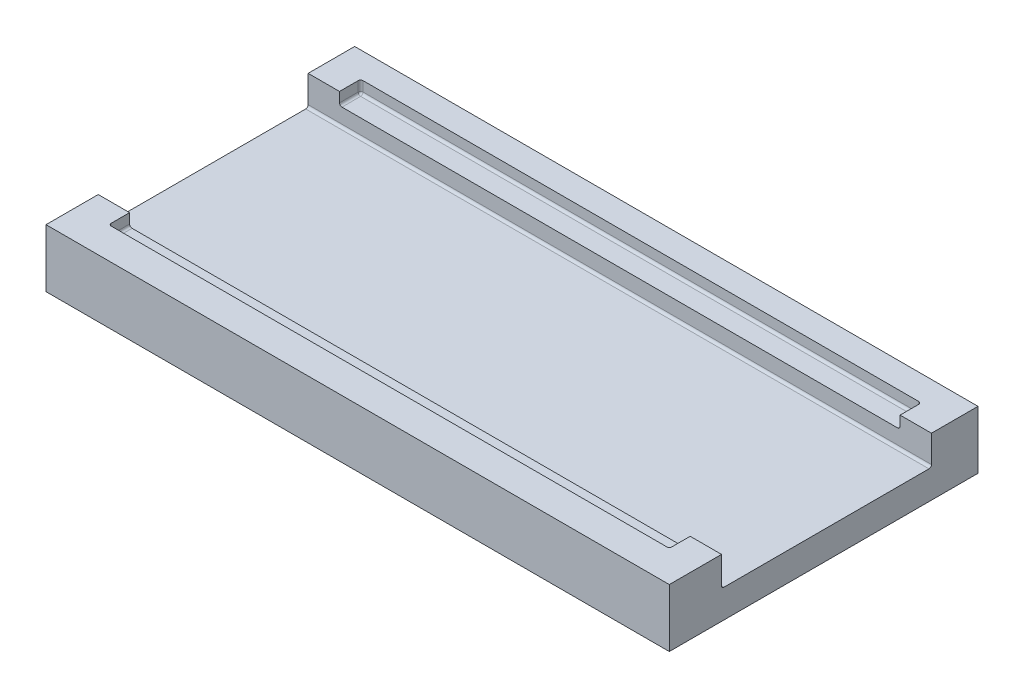
ISO-10303-21;
HEADER;
FILE_DESCRIPTION(('STEP AP214'),'2;1');
FILE_NAME('part.step','',(''),(''),'','','');
FILE_SCHEMA(('AUTOMOTIVE_DESIGN { 1 0 10303 214 1 1 1 1 }'));
ENDSEC;
DATA;
#1=APPLICATION_CONTEXT('core data for automotive mechanical design processes');
#2=APPLICATION_PROTOCOL_DEFINITION('international standard','automotive_design',2000,#1);
#3=PRODUCT_CONTEXT('',#1,'mechanical');
#4=PRODUCT('Part','Part','',(#3));
#5=PRODUCT_RELATED_PRODUCT_CATEGORY('part','',(#4));
#6=PRODUCT_DEFINITION_FORMATION('','',#4);
#7=PRODUCT_DEFINITION_CONTEXT('part definition',#1,'design');
#8=PRODUCT_DEFINITION('design','',#6,#7);
#9=PRODUCT_DEFINITION_SHAPE('','',#8);
#10=(LENGTH_UNIT() NAMED_UNIT(*) SI_UNIT(.MILLI.,.METRE.));
#11=(NAMED_UNIT(*) PLANE_ANGLE_UNIT() SI_UNIT($,.RADIAN.));
#12=(NAMED_UNIT(*) SI_UNIT($,.STERADIAN.) SOLID_ANGLE_UNIT());
#13=UNCERTAINTY_MEASURE_WITH_UNIT(LENGTH_MEASURE(1.E-05),#10,'distance_accuracy_value','');
#14=(GEOMETRIC_REPRESENTATION_CONTEXT(3) GLOBAL_UNCERTAINTY_ASSIGNED_CONTEXT((#13)) GLOBAL_UNIT_ASSIGNED_CONTEXT((#10,
#11,#12)) REPRESENTATION_CONTEXT('',''));
#15=CARTESIAN_POINT('',(0.,0.,0.));
#16=DIRECTION('',(0.,0.,1.));
#17=DIRECTION('',(1.,0.,0.));
#18=AXIS2_PLACEMENT_3D('',#15,#16,#17);
#19=CARTESIAN_POINT('',(0.,23.5,0.));
#20=DIRECTION('',(0.,-1.,0.));
#21=DIRECTION('',(0.,0.,-1.));
#22=AXIS2_PLACEMENT_3D('',#19,#20,#21);
#23=PLANE('',#22);
#24=DIRECTION('',(0.,0.,-1.));
#25=VECTOR('',#24,1.);
#26=CARTESIAN_POINT('',(252.4,23.5,0.));
#27=LINE('',#26,#25);
#28=CARTESIAN_POINT('',(252.4,23.5,0.));
#29=VERTEX_POINT('',#28);
#30=CARTESIAN_POINT('',(252.4,23.5,-21.15));
#31=VERTEX_POINT('',#30);
#32=EDGE_CURVE('E250',#29,#31,#27,.T.);
#33=ORIENTED_EDGE('',*,*,#32,.T.);
#34=DIRECTION('',(1.,0.,0.));
#35=VECTOR('',#34,1.);
#36=CARTESIAN_POINT('',(239.7,23.5,-21.15));
#37=LINE('',#36,#35);
#38=CARTESIAN_POINT('',(239.7,23.5,-21.15));
#39=VERTEX_POINT('',#38);
#40=EDGE_CURVE('E224',#39,#31,#37,.T.);
#41=ORIENTED_EDGE('',*,*,#40,.F.);
#42=DIRECTION('',(0.,0.,-1.));
#43=VECTOR('',#42,1.);
#44=CARTESIAN_POINT('',(239.7,23.5,-114.7));
#45=LINE('',#44,#43);
#46=CARTESIAN_POINT('',(239.7,23.5,-13.7));
#47=VERTEX_POINT('',#46);
#48=EDGE_CURVE('E230',#47,#39,#45,.T.);
#49=ORIENTED_EDGE('',*,*,#48,.F.);
#50=CARTESIAN_POINT('',(238.7,23.5,-13.7));
#51=DIRECTION('',(0.,-1.,0.));
#52=DIRECTION('',(0.,0.,-1.));
#53=AXIS2_PLACEMENT_3D('',#50,#51,#52);
#54=CIRCLE('',#53,1.);
#55=CARTESIAN_POINT('',(238.7,23.5,-12.7));
#56=VERTEX_POINT('',#55);
#57=EDGE_CURVE('E325',#47,#56,#54,.T.);
#58=ORIENTED_EDGE('',*,*,#57,.T.);
#59=DIRECTION('',(1.,0.,0.));
#60=VECTOR('',#59,1.);
#61=CARTESIAN_POINT('',(12.7000000000002,23.5,-12.7));
#62=LINE('',#61,#60);
#63=CARTESIAN_POINT('',(13.7000000000002,23.5,-12.7));
#64=VERTEX_POINT('',#63);
#65=EDGE_CURVE('E231',#64,#56,#62,.T.);
#66=ORIENTED_EDGE('',*,*,#65,.F.);
#67=CARTESIAN_POINT('',(13.7000000000002,23.5,-13.7));
#68=DIRECTION('',(0.,-1.,0.));
#69=DIRECTION('',(0.,0.,-1.));
#70=AXIS2_PLACEMENT_3D('',#67,#68,#69);
#71=CIRCLE('',#70,1.);
#72=CARTESIAN_POINT('',(12.7000000000002,23.5,-13.7));
#73=VERTEX_POINT('',#72);
#74=EDGE_CURVE('E331',#64,#73,#71,.T.);
#75=ORIENTED_EDGE('',*,*,#74,.T.);
#76=DIRECTION('',(0.,0.,1.));
#77=VECTOR('',#76,1.);
#78=CARTESIAN_POINT('',(12.7000000000001,23.5,-114.7));
#79=LINE('',#78,#77);
#80=CARTESIAN_POINT('',(12.7000000000001,23.5,-21.15));
#81=VERTEX_POINT('',#80);
#82=EDGE_CURVE('E423',#81,#73,#79,.T.);
#83=ORIENTED_EDGE('',*,*,#82,.F.);
#84=DIRECTION('',(1.,0.,0.));
#85=VECTOR('',#84,1.);
#86=CARTESIAN_POINT('',(1.38777878078145E-13,23.5,-21.15));
#87=LINE('',#86,#85);
#88=CARTESIAN_POINT('',(1.38777878078145E-13,23.5,-21.15));
#89=VERTEX_POINT('',#88);
#90=EDGE_CURVE('E452',#89,#81,#87,.T.);
#91=ORIENTED_EDGE('',*,*,#90,.F.);
#92=DIRECTION('',(0.,0.,1.));
#93=VECTOR('',#92,1.);
#94=CARTESIAN_POINT('',(0.,23.5,0.));
#95=LINE('',#94,#93);
#96=CARTESIAN_POINT('',(0.,23.5,0.));
#97=VERTEX_POINT('',#96);
#98=EDGE_CURVE('E247',#89,#97,#95,.T.);
#99=ORIENTED_EDGE('',*,*,#98,.T.);
#100=DIRECTION('',(1.,0.,0.));
#101=VECTOR('',#100,1.);
#102=CARTESIAN_POINT('',(0.,23.5,0.));
#103=LINE('',#102,#101);
#104=EDGE_CURVE('E246',#97,#29,#103,.T.);
#105=ORIENTED_EDGE('',*,*,#104,.T.);
#106=EDGE_LOOP('',(#33,#41,#49,#58,#66,#75,#83,#91,#99,#105));
#107=FACE_BOUND('',#106,.T.);
#108=ADVANCED_FACE('F33',(#107),#23,.F.);
#109=CARTESIAN_POINT('',(239.7,18.5,-114.7));
#110=DIRECTION('',(1.,0.,0.));
#111=DIRECTION('',(0.,0.,-1.));
#112=AXIS2_PLACEMENT_3D('',#109,#110,#111);
#113=PLANE('',#112);
#114=DIRECTION('',(0.,0.,-1.));
#115=VECTOR('',#114,1.);
#116=CARTESIAN_POINT('',(239.7,19.5,-114.7));
#117=LINE('',#116,#115);
#118=CARTESIAN_POINT('',(239.7,19.5,-21.15));
#119=VERTEX_POINT('',#118);
#120=CARTESIAN_POINT('',(239.7,19.5,-13.7));
#121=VERTEX_POINT('',#120);
#122=EDGE_CURVE('E275',#119,#121,#117,.F.);
#123=ORIENTED_EDGE('',*,*,#122,.T.);
#124=DIRECTION('',(0.,1.,0.));
#125=VECTOR('',#124,1.);
#126=CARTESIAN_POINT('',(239.7,23.5,-13.7));
#127=LINE('',#126,#125);
#128=EDGE_CURVE('E277',#121,#47,#127,.T.);
#129=ORIENTED_EDGE('',*,*,#128,.T.);
#130=ORIENTED_EDGE('',*,*,#48,.T.);
#131=DIRECTION('',(0.,1.,0.));
#132=VECTOR('',#131,1.);
#133=CARTESIAN_POINT('',(239.7,-74.4435279704062,-21.15));
#134=LINE('',#133,#132);
#135=EDGE_CURVE('E215',#119,#39,#134,.T.);
#136=ORIENTED_EDGE('',*,*,#135,.F.);
#137=EDGE_LOOP('',(#123,#129,#130,#136));
#138=FACE_BOUND('',#137,.T.);
#139=ADVANCED_FACE('F510',(#138),#113,.F.);
#140=CARTESIAN_POINT('',(12.7000000000001,18.5,-114.7));
#141=DIRECTION('',(-1.,0.,0.));
#142=DIRECTION('',(0.,0.,1.));
#143=AXIS2_PLACEMENT_3D('',#140,#141,#142);
#144=PLANE('',#143);
#145=DIRECTION('',(0.,0.,1.));
#146=VECTOR('',#145,1.);
#147=CARTESIAN_POINT('',(12.7000000000001,19.5,-114.7));
#148=LINE('',#147,#146);
#149=CARTESIAN_POINT('',(12.7000000000001,19.5,-106.15));
#150=VERTEX_POINT('',#149);
#151=CARTESIAN_POINT('',(12.7000000000001,19.5,-113.7));
#152=VERTEX_POINT('',#151);
#153=EDGE_CURVE('E304',#150,#152,#148,.F.);
#154=ORIENTED_EDGE('',*,*,#153,.T.);
#155=DIRECTION('',(0.,1.,0.));
#156=VECTOR('',#155,1.);
#157=CARTESIAN_POINT('',(12.7000000000001,23.5,-113.7));
#158=LINE('',#157,#156);
#159=CARTESIAN_POINT('',(12.7000000000001,23.5,-113.7));
#160=VERTEX_POINT('',#159);
#161=EDGE_CURVE('E306',#152,#160,#158,.T.);
#162=ORIENTED_EDGE('',*,*,#161,.T.);
#163=CARTESIAN_POINT('',(12.7000000000001,23.5,-106.15));
#164=VERTEX_POINT('',#163);
#165=EDGE_CURVE('E236',#160,#164,#79,.T.);
#166=ORIENTED_EDGE('',*,*,#165,.T.);
#167=DIRECTION('',(0.,1.,0.));
#168=VECTOR('',#167,1.);
#169=CARTESIAN_POINT('',(12.7000000000001,11.5,-106.15));
#170=LINE('',#169,#168);
#171=EDGE_CURVE('E403',#150,#164,#170,.T.);
#172=ORIENTED_EDGE('',*,*,#171,.F.);
#173=EDGE_LOOP('',(#154,#162,#166,#172));
#174=FACE_BOUND('',#173,.T.);
#175=ADVANCED_FACE('F407',(#174),#144,.F.);
#176=CARTESIAN_POINT('',(0.,18.5,0.));
#177=DIRECTION('',(0.,1.,0.));
#178=DIRECTION('',(0.,0.,1.));
#179=AXIS2_PLACEMENT_3D('',#176,#177,#178);
#180=PLANE('',#179);
#181=DIRECTION('',(-1.,0.,0.));
#182=VECTOR('',#181,1.);
#183=CARTESIAN_POINT('',(239.7,18.5,-106.15));
#184=LINE('',#183,#182);
#185=CARTESIAN_POINT('',(238.7,18.5,-106.15));
#186=VERTEX_POINT('',#185);
#187=CARTESIAN_POINT('',(13.7000000000001,18.5,-106.15));
#188=VERTEX_POINT('',#187);
#189=EDGE_CURVE('E405',#186,#188,#184,.T.);
#190=ORIENTED_EDGE('',*,*,#189,.F.);
#191=DIRECTION('',(0.,0.,-1.));
#192=VECTOR('',#191,1.);
#193=CARTESIAN_POINT('',(238.7,18.5,0.));
#194=LINE('',#193,#192);
#195=CARTESIAN_POINT('',(238.7,18.5,-113.7));
#196=VERTEX_POINT('',#195);
#197=EDGE_CURVE('E322',#186,#196,#194,.T.);
#198=ORIENTED_EDGE('',*,*,#197,.T.);
#199=DIRECTION('',(-1.,0.,0.));
#200=VECTOR('',#199,1.);
#201=CARTESIAN_POINT('',(0.,18.5,-113.7));
#202=LINE('',#201,#200);
#203=CARTESIAN_POINT('',(13.7000000000001,18.5,-113.7));
#204=VERTEX_POINT('',#203);
#205=EDGE_CURVE('E318',#196,#204,#202,.T.);
#206=ORIENTED_EDGE('',*,*,#205,.T.);
#207=DIRECTION('',(0.,0.,1.));
#208=VECTOR('',#207,1.);
#209=CARTESIAN_POINT('',(13.7000000000002,18.5,0.));
#210=LINE('',#209,#208);
#211=EDGE_CURVE('E320',#204,#188,#210,.T.);
#212=ORIENTED_EDGE('',*,*,#211,.T.);
#213=EDGE_LOOP('',(#190,#198,#206,#212));
#214=FACE_BOUND('',#213,.T.);
#215=ADVANCED_FACE('F392',(#214),#180,.T.);
#216=CARTESIAN_POINT('',(0.,23.5,0.));
#217=DIRECTION('',(1.,0.,0.));
#218=DIRECTION('',(0.,0.,-1.));
#219=AXIS2_PLACEMENT_3D('',#216,#217,#218);
#220=PLANE('',#219);
#221=DIRECTION('',(0.,0.,1.));
#222=VECTOR('',#221,1.);
#223=CARTESIAN_POINT('',(1.38777878078145E-13,11.5,-21.15));
#224=LINE('',#223,#222);
#225=CARTESIAN_POINT('',(1.38777878078145E-13,11.5,-105.15));
#226=VERTEX_POINT('',#225);
#227=CARTESIAN_POINT('',(1.38777878078145E-13,11.5,-22.15));
#228=VERTEX_POINT('',#227);
#229=EDGE_CURVE('E419',#226,#228,#224,.T.);
#230=ORIENTED_EDGE('',*,*,#229,.F.);
#231=CARTESIAN_POINT('',(1.16739951039335E-13,12.5,-105.15));
#232=DIRECTION('',(1.,0.,0.));
#233=DIRECTION('',(0.,0.,-1.));
#234=AXIS2_PLACEMENT_3D('',#231,#232,#233);
#235=CIRCLE('',#234,1.);
#236=CARTESIAN_POINT('',(1.38777878078145E-13,12.5,-106.15));
#237=VERTEX_POINT('',#236);
#238=EDGE_CURVE('E42',#226,#237,#235,.T.);
#239=ORIENTED_EDGE('',*,*,#238,.T.);
#240=DIRECTION('',(0.,1.,0.));
#241=VECTOR('',#240,1.);
#242=CARTESIAN_POINT('',(1.38777878078145E-13,11.5,-106.15));
#243=LINE('',#242,#241);
#244=CARTESIAN_POINT('',(1.38777878078145E-13,23.5,-106.15));
#245=VERTEX_POINT('',#244);
#246=EDGE_CURVE('E410',#237,#245,#243,.T.);
#247=ORIENTED_EDGE('',*,*,#246,.T.);
#248=CARTESIAN_POINT('',(1.38777878078145E-13,23.5,-125.));
#249=VERTEX_POINT('',#248);
#250=EDGE_CURVE('E243',#249,#245,#95,.T.);
#251=ORIENTED_EDGE('',*,*,#250,.F.);
#252=DIRECTION('',(0.,-1.,0.));
#253=VECTOR('',#252,1.);
#254=CARTESIAN_POINT('',(1.38777878078145E-13,23.5,-125.));
#255=LINE('',#254,#253);
#256=CARTESIAN_POINT('',(1.38777878078145E-13,0.,-125.));
#257=VERTEX_POINT('',#256);
#258=EDGE_CURVE('E255',#249,#257,#255,.T.);
#259=ORIENTED_EDGE('',*,*,#258,.T.);
#260=DIRECTION('',(0.,0.,1.));
#261=VECTOR('',#260,1.);
#262=CARTESIAN_POINT('',(0.,0.,0.));
#263=LINE('',#262,#261);
#264=CARTESIAN_POINT('',(0.,0.,0.));
#265=VERTEX_POINT('',#264);
#266=EDGE_CURVE('E242',#257,#265,#263,.T.);
#267=ORIENTED_EDGE('',*,*,#266,.T.);
#268=DIRECTION('',(0.,-1.,0.));
#269=VECTOR('',#268,1.);
#270=CARTESIAN_POINT('',(0.,23.5,0.));
#271=LINE('',#270,#269);
#272=EDGE_CURVE('E272',#97,#265,#271,.T.);
#273=ORIENTED_EDGE('',*,*,#272,.F.);
#274=ORIENTED_EDGE('',*,*,#98,.F.);
#275=DIRECTION('',(0.,1.,0.));
#276=VECTOR('',#275,1.);
#277=CARTESIAN_POINT('',(1.38777878078145E-13,11.5,-21.15));
#278=LINE('',#277,#276);
#279=CARTESIAN_POINT('',(1.38777878078145E-13,12.5,-21.15));
#280=VERTEX_POINT('',#279);
#281=EDGE_CURVE('E414',#280,#89,#278,.T.);
#282=ORIENTED_EDGE('',*,*,#281,.F.);
#283=CARTESIAN_POINT('',(0.,12.5,-22.15));
#284=DIRECTION('',(1.,0.,0.));
#285=DIRECTION('',(0.,0.,-1.));
#286=AXIS2_PLACEMENT_3D('',#283,#284,#285);
#287=CIRCLE('',#286,1.);
#288=EDGE_CURVE('E335',#280,#228,#287,.T.);
#289=ORIENTED_EDGE('',*,*,#288,.T.);
#290=EDGE_LOOP('',(#230,#239,#247,#251,#259,#267,#273,#274,#282,#289));
#291=FACE_BOUND('',#290,.T.);
#292=ADVANCED_FACE('F485',(#291),#220,.F.);
#293=CARTESIAN_POINT('',(0.,23.5,0.));
#294=DIRECTION('',(0.,0.,-1.));
#295=DIRECTION('',(-1.,0.,0.));
#296=AXIS2_PLACEMENT_3D('',#293,#294,#295);
#297=PLANE('',#296);
#298=DIRECTION('',(1.,0.,0.));
#299=VECTOR('',#298,1.);
#300=CARTESIAN_POINT('',(0.,0.,0.));
#301=LINE('',#300,#299);
#302=CARTESIAN_POINT('',(252.4,0.,0.));
#303=VERTEX_POINT('',#302);
#304=EDGE_CURVE('E258',#265,#303,#301,.T.);
#305=ORIENTED_EDGE('',*,*,#304,.T.);
#306=DIRECTION('',(0.,-1.,0.));
#307=VECTOR('',#306,1.);
#308=CARTESIAN_POINT('',(252.4,23.5,0.));
#309=LINE('',#308,#307);
#310=EDGE_CURVE('E269',#29,#303,#309,.T.);
#311=ORIENTED_EDGE('',*,*,#310,.F.);
#312=ORIENTED_EDGE('',*,*,#104,.F.);
#313=ORIENTED_EDGE('',*,*,#272,.T.);
#314=EDGE_LOOP('',(#305,#311,#312,#313));
#315=FACE_BOUND('',#314,.T.);
#316=ADVANCED_FACE('F488',(#315),#297,.F.);
#317=CARTESIAN_POINT('',(252.4,23.5,0.));
#318=DIRECTION('',(-1.,0.,0.));
#319=DIRECTION('',(0.,0.,1.));
#320=AXIS2_PLACEMENT_3D('',#317,#318,#319);
#321=PLANE('',#320);
#322=DIRECTION('',(0.,0.,-1.));
#323=VECTOR('',#322,1.);
#324=CARTESIAN_POINT('',(252.4,11.5,-21.15));
#325=LINE('',#324,#323);
#326=CARTESIAN_POINT('',(252.4,11.5,-22.15));
#327=VERTEX_POINT('',#326);
#328=CARTESIAN_POINT('',(252.4,11.5,-105.15));
#329=VERTEX_POINT('',#328);
#330=EDGE_CURVE('E462',#327,#329,#325,.T.);
#331=ORIENTED_EDGE('',*,*,#330,.F.);
#332=CARTESIAN_POINT('',(252.4,12.5,-22.15));
#333=DIRECTION('',(-1.,0.,0.));
#334=DIRECTION('',(0.,0.,1.));
#335=AXIS2_PLACEMENT_3D('',#332,#333,#334);
#336=CIRCLE('',#335,1.);
#337=CARTESIAN_POINT('',(252.4,12.5,-21.15));
#338=VERTEX_POINT('',#337);
#339=EDGE_CURVE('E333',#327,#338,#336,.T.);
#340=ORIENTED_EDGE('',*,*,#339,.T.);
#341=DIRECTION('',(0.,1.,0.));
#342=VECTOR('',#341,1.);
#343=CARTESIAN_POINT('',(252.4,-74.4435279704062,-21.15));
#344=LINE('',#343,#342);
#345=EDGE_CURVE('E223',#338,#31,#344,.T.);
#346=ORIENTED_EDGE('',*,*,#345,.T.);
#347=ORIENTED_EDGE('',*,*,#32,.F.);
#348=ORIENTED_EDGE('',*,*,#310,.T.);
#349=DIRECTION('',(0.,0.,-1.));
#350=VECTOR('',#349,1.);
#351=CARTESIAN_POINT('',(252.4,0.,0.));
#352=LINE('',#351,#350);
#353=CARTESIAN_POINT('',(252.4,0.,-125.));
#354=VERTEX_POINT('',#353);
#355=EDGE_CURVE('E260',#303,#354,#352,.T.);
#356=ORIENTED_EDGE('',*,*,#355,.T.);
#357=DIRECTION('',(0.,-1.,0.));
#358=VECTOR('',#357,1.);
#359=CARTESIAN_POINT('',(252.4,23.5,-125.));
#360=LINE('',#359,#358);
#361=CARTESIAN_POINT('',(252.4,23.5,-125.));
#362=VERTEX_POINT('',#361);
#363=EDGE_CURVE('E266',#362,#354,#360,.T.);
#364=ORIENTED_EDGE('',*,*,#363,.F.);
#365=CARTESIAN_POINT('',(252.4,23.5,-106.15));
#366=VERTEX_POINT('',#365);
#367=EDGE_CURVE('E249',#366,#362,#27,.T.);
#368=ORIENTED_EDGE('',*,*,#367,.F.);
#369=DIRECTION('',(0.,1.,0.));
#370=VECTOR('',#369,1.);
#371=CARTESIAN_POINT('',(252.4,-74.4435279704062,-106.15));
#372=LINE('',#371,#370);
#373=CARTESIAN_POINT('',(252.4,12.5,-106.15));
#374=VERTEX_POINT('',#373);
#375=EDGE_CURVE('E216',#374,#366,#372,.T.);
#376=ORIENTED_EDGE('',*,*,#375,.F.);
#377=CARTESIAN_POINT('',(252.4,12.5,-105.15));
#378=DIRECTION('',(-1.,0.,0.));
#379=DIRECTION('',(0.,0.,1.));
#380=AXIS2_PLACEMENT_3D('',#377,#378,#379);
#381=CIRCLE('',#380,1.);
#382=EDGE_CURVE('E11',#374,#329,#381,.T.);
#383=ORIENTED_EDGE('',*,*,#382,.T.);
#384=EDGE_LOOP('',(#331,#340,#346,#347,#348,#356,#364,#368,#376,#383));
#385=FACE_BOUND('',#384,.T.);
#386=ADVANCED_FACE('F476',(#385),#321,.F.);
#387=CARTESIAN_POINT('',(1.38777878078145E-13,23.5,-125.));
#388=DIRECTION('',(0.,0.,1.));
#389=DIRECTION('',(1.,0.,0.));
#390=AXIS2_PLACEMENT_3D('',#387,#388,#389);
#391=PLANE('',#390);
#392=DIRECTION('',(-1.,0.,0.));
#393=VECTOR('',#392,1.);
#394=CARTESIAN_POINT('',(1.38777878078145E-13,0.,-125.));
#395=LINE('',#394,#393);
#396=EDGE_CURVE('E262',#354,#257,#395,.T.);
#397=ORIENTED_EDGE('',*,*,#396,.T.);
#398=ORIENTED_EDGE('',*,*,#258,.F.);
#399=DIRECTION('',(-1.,0.,0.));
#400=VECTOR('',#399,1.);
#401=CARTESIAN_POINT('',(1.38777878078145E-13,23.5,-125.));
#402=LINE('',#401,#400);
#403=EDGE_CURVE('E253',#362,#249,#402,.T.);
#404=ORIENTED_EDGE('',*,*,#403,.F.);
#405=ORIENTED_EDGE('',*,*,#363,.T.);
#406=EDGE_LOOP('',(#397,#398,#404,#405));
#407=FACE_BOUND('',#406,.T.);
#408=ADVANCED_FACE('F496',(#407),#391,.F.);
#409=CARTESIAN_POINT('',(239.7,23.5,-106.15));
#410=VERTEX_POINT('',#409);
#411=CARTESIAN_POINT('',(239.7,23.5,-113.7));
#412=VERTEX_POINT('',#411);
#413=EDGE_CURVE('E210',#410,#412,#45,.T.);
#414=ORIENTED_EDGE('',*,*,#413,.F.);
#415=DIRECTION('',(-1.,0.,0.));
#416=VECTOR('',#415,1.);
#417=CARTESIAN_POINT('',(239.7,23.5,-106.15));
#418=LINE('',#417,#416);
#419=EDGE_CURVE('E219',#366,#410,#418,.T.);
#420=ORIENTED_EDGE('',*,*,#419,.F.);
#421=ORIENTED_EDGE('',*,*,#367,.T.);
#422=ORIENTED_EDGE('',*,*,#403,.T.);
#423=ORIENTED_EDGE('',*,*,#250,.T.);
#424=DIRECTION('',(-1.,0.,0.));
#425=VECTOR('',#424,1.);
#426=CARTESIAN_POINT('',(1.38777878078145E-13,23.5,-106.15));
#427=LINE('',#426,#425);
#428=EDGE_CURVE('E455',#164,#245,#427,.T.);
#429=ORIENTED_EDGE('',*,*,#428,.F.);
#430=ORIENTED_EDGE('',*,*,#165,.F.);
#431=CARTESIAN_POINT('',(13.7000000000001,23.5,-113.7));
#432=DIRECTION('',(0.,-1.,0.));
#433=DIRECTION('',(0.,0.,-1.));
#434=AXIS2_PLACEMENT_3D('',#431,#432,#433);
#435=CIRCLE('',#434,1.);
#436=CARTESIAN_POINT('',(13.7000000000001,23.5,-114.7));
#437=VERTEX_POINT('',#436);
#438=EDGE_CURVE('E337',#160,#437,#435,.T.);
#439=ORIENTED_EDGE('',*,*,#438,.T.);
#440=DIRECTION('',(-1.,0.,0.));
#441=VECTOR('',#440,1.);
#442=CARTESIAN_POINT('',(12.7000000000001,23.5,-114.7));
#443=LINE('',#442,#441);
#444=CARTESIAN_POINT('',(238.7,23.5,-114.7));
#445=VERTEX_POINT('',#444);
#446=EDGE_CURVE('E234',#445,#437,#443,.T.);
#447=ORIENTED_EDGE('',*,*,#446,.F.);
#448=CARTESIAN_POINT('',(238.7,23.5,-113.7));
#449=DIRECTION('',(0.,-1.,0.));
#450=DIRECTION('',(0.,0.,-1.));
#451=AXIS2_PLACEMENT_3D('',#448,#449,#450);
#452=CIRCLE('',#451,1.);
#453=EDGE_CURVE('E229',#445,#412,#452,.T.);
#454=ORIENTED_EDGE('',*,*,#453,.T.);
#455=EDGE_LOOP('',(#414,#420,#421,#422,#423,#429,#430,#439,#447,#454));
#456=FACE_BOUND('',#455,.T.);
#457=ADVANCED_FACE('F226',(#456),#23,.F.);
#458=CARTESIAN_POINT('',(0.,0.,0.));
#459=DIRECTION('',(0.,-1.,0.));
#460=DIRECTION('',(0.,0.,-1.));
#461=AXIS2_PLACEMENT_3D('',#458,#459,#460);
#462=PLANE('',#461);
#463=ORIENTED_EDGE('',*,*,#266,.F.);
#464=ORIENTED_EDGE('',*,*,#396,.F.);
#465=ORIENTED_EDGE('',*,*,#355,.F.);
#466=ORIENTED_EDGE('',*,*,#304,.F.);
#467=EDGE_LOOP('',(#463,#464,#465,#466));
#468=FACE_BOUND('',#467,.T.);
#469=ADVANCED_FACE('F491',(#468),#462,.T.);
#470=DIRECTION('',(0.,1.,0.));
#471=VECTOR('',#470,1.);
#472=CARTESIAN_POINT('',(12.7000000000002,18.5,-13.7));
#473=LINE('',#472,#471);
#474=CARTESIAN_POINT('',(12.7000000000002,19.5,-13.7));
#475=VERTEX_POINT('',#474);
#476=EDGE_CURVE('E292',#73,#475,#473,.F.);
#477=ORIENTED_EDGE('',*,*,#476,.T.);
#478=DIRECTION('',(0.,0.,1.));
#479=VECTOR('',#478,1.);
#480=CARTESIAN_POINT('',(12.7000000000001,19.5,-114.7));
#481=LINE('',#480,#479);
#482=CARTESIAN_POINT('',(12.7000000000001,19.5,-21.15));
#483=VERTEX_POINT('',#482);
#484=EDGE_CURVE('E294',#475,#483,#481,.F.);
#485=ORIENTED_EDGE('',*,*,#484,.T.);
#486=DIRECTION('',(0.,1.,0.));
#487=VECTOR('',#486,1.);
#488=CARTESIAN_POINT('',(12.7000000000001,11.5,-21.15));
#489=LINE('',#488,#487);
#490=EDGE_CURVE('E411',#483,#81,#489,.T.);
#491=ORIENTED_EDGE('',*,*,#490,.T.);
#492=ORIENTED_EDGE('',*,*,#82,.T.);
#493=EDGE_LOOP('',(#477,#485,#491,#492));
#494=FACE_BOUND('',#493,.T.);
#495=ADVANCED_FACE('F428',(#494),#144,.F.);
#496=CARTESIAN_POINT('',(12.7000000000001,18.5,-114.7));
#497=DIRECTION('',(0.,0.,-1.));
#498=DIRECTION('',(-1.,0.,0.));
#499=AXIS2_PLACEMENT_3D('',#496,#497,#498);
#500=PLANE('',#499);
#501=ORIENTED_EDGE('',*,*,#446,.T.);
#502=DIRECTION('',(0.,1.,0.));
#503=VECTOR('',#502,1.);
#504=CARTESIAN_POINT('',(13.7000000000001,18.5,-114.7));
#505=LINE('',#504,#503);
#506=CARTESIAN_POINT('',(13.7000000000001,19.5,-114.7));
#507=VERTEX_POINT('',#506);
#508=EDGE_CURVE('E313',#437,#507,#505,.F.);
#509=ORIENTED_EDGE('',*,*,#508,.T.);
#510=DIRECTION('',(-1.,0.,0.));
#511=VECTOR('',#510,1.);
#512=CARTESIAN_POINT('',(12.7000000000001,19.5,-114.7));
#513=LINE('',#512,#511);
#514=CARTESIAN_POINT('',(238.7,19.5,-114.7));
#515=VERTEX_POINT('',#514);
#516=EDGE_CURVE('E309',#507,#515,#513,.F.);
#517=ORIENTED_EDGE('',*,*,#516,.T.);
#518=DIRECTION('',(0.,1.,0.));
#519=VECTOR('',#518,1.);
#520=CARTESIAN_POINT('',(238.7,23.5,-114.7));
#521=LINE('',#520,#519);
#522=EDGE_CURVE('E311',#515,#445,#521,.T.);
#523=ORIENTED_EDGE('',*,*,#522,.T.);
#524=EDGE_LOOP('',(#501,#509,#517,#523));
#525=FACE_BOUND('',#524,.T.);
#526=ADVANCED_FACE('F575',(#525),#500,.F.);
#527=ORIENTED_EDGE('',*,*,#413,.T.);
#528=DIRECTION('',(0.,1.,0.));
#529=VECTOR('',#528,1.);
#530=CARTESIAN_POINT('',(239.7,18.5,-113.7));
#531=LINE('',#530,#529);
#532=CARTESIAN_POINT('',(239.7,19.5,-113.7));
#533=VERTEX_POINT('',#532);
#534=EDGE_CURVE('E316',#412,#533,#531,.F.);
#535=ORIENTED_EDGE('',*,*,#534,.T.);
#536=DIRECTION('',(0.,0.,-1.));
#537=VECTOR('',#536,1.);
#538=CARTESIAN_POINT('',(239.7,19.5,-114.7));
#539=LINE('',#538,#537);
#540=CARTESIAN_POINT('',(239.7,19.5,-106.15));
#541=VERTEX_POINT('',#540);
#542=EDGE_CURVE('E213',#533,#541,#539,.F.);
#543=ORIENTED_EDGE('',*,*,#542,.T.);
#544=DIRECTION('',(0.,1.,0.));
#545=VECTOR('',#544,1.);
#546=CARTESIAN_POINT('',(239.7,-74.4435279704062,-106.15));
#547=LINE('',#546,#545);
#548=EDGE_CURVE('E206',#541,#410,#547,.T.);
#549=ORIENTED_EDGE('',*,*,#548,.T.);
#550=EDGE_LOOP('',(#527,#535,#543,#549));
#551=FACE_BOUND('',#550,.T.);
#552=ADVANCED_FACE('F208',(#551),#113,.F.);
#553=CARTESIAN_POINT('',(12.7000000000002,18.5,-12.7));
#554=DIRECTION('',(0.,0.,1.));
#555=DIRECTION('',(1.,0.,0.));
#556=AXIS2_PLACEMENT_3D('',#553,#554,#555);
#557=PLANE('',#556);
#558=ORIENTED_EDGE('',*,*,#65,.T.);
#559=DIRECTION('',(0.,1.,0.));
#560=VECTOR('',#559,1.);
#561=CARTESIAN_POINT('',(238.7,18.5,-12.7));
#562=LINE('',#561,#560);
#563=CARTESIAN_POINT('',(238.7,19.5,-12.7));
#564=VERTEX_POINT('',#563);
#565=EDGE_CURVE('E284',#56,#564,#562,.F.);
#566=ORIENTED_EDGE('',*,*,#565,.T.);
#567=DIRECTION('',(1.,0.,0.));
#568=VECTOR('',#567,1.);
#569=CARTESIAN_POINT('',(12.7000000000002,19.5,-12.7));
#570=LINE('',#569,#568);
#571=CARTESIAN_POINT('',(13.7000000000002,19.5,-12.7));
#572=VERTEX_POINT('',#571);
#573=EDGE_CURVE('E280',#564,#572,#570,.F.);
#574=ORIENTED_EDGE('',*,*,#573,.T.);
#575=DIRECTION('',(0.,1.,0.));
#576=VECTOR('',#575,1.);
#577=CARTESIAN_POINT('',(13.7000000000002,23.5,-12.7));
#578=LINE('',#577,#576);
#579=EDGE_CURVE('E282',#572,#64,#578,.T.);
#580=ORIENTED_EDGE('',*,*,#579,.T.);
#581=EDGE_LOOP('',(#558,#566,#574,#580));
#582=FACE_BOUND('',#581,.T.);
#583=ADVANCED_FACE('F584',(#582),#557,.F.);
#584=DIRECTION('',(1.,0.,0.));
#585=VECTOR('',#584,1.);
#586=CARTESIAN_POINT('',(0.,18.5,-13.7));
#587=LINE('',#586,#585);
#588=CARTESIAN_POINT('',(13.7000000000002,18.5,-13.7));
#589=VERTEX_POINT('',#588);
#590=CARTESIAN_POINT('',(238.7,18.5,-13.7));
#591=VERTEX_POINT('',#590);
#592=EDGE_CURVE('E286',#589,#591,#587,.T.);
#593=ORIENTED_EDGE('',*,*,#592,.T.);
#594=DIRECTION('',(0.,0.,-1.));
#595=VECTOR('',#594,1.);
#596=CARTESIAN_POINT('',(238.7,18.5,0.));
#597=LINE('',#596,#595);
#598=CARTESIAN_POINT('',(238.7,18.5,-21.15));
#599=VERTEX_POINT('',#598);
#600=EDGE_CURVE('E290',#591,#599,#597,.T.);
#601=ORIENTED_EDGE('',*,*,#600,.T.);
#602=DIRECTION('',(1.,0.,0.));
#603=VECTOR('',#602,1.);
#604=CARTESIAN_POINT('',(239.7,18.5,-21.15));
#605=LINE('',#604,#603);
#606=CARTESIAN_POINT('',(13.7000000000002,18.5,-21.15));
#607=VERTEX_POINT('',#606);
#608=EDGE_CURVE('E421',#607,#599,#605,.T.);
#609=ORIENTED_EDGE('',*,*,#608,.F.);
#610=DIRECTION('',(0.,0.,1.));
#611=VECTOR('',#610,1.);
#612=CARTESIAN_POINT('',(13.7000000000002,18.5,0.));
#613=LINE('',#612,#611);
#614=EDGE_CURVE('E288',#607,#589,#613,.T.);
#615=ORIENTED_EDGE('',*,*,#614,.T.);
#616=EDGE_LOOP('',(#593,#601,#609,#615));
#617=FACE_BOUND('',#616,.T.);
#618=ADVANCED_FACE('F586',(#617),#180,.T.);
#619=CARTESIAN_POINT('',(239.7,11.5,-21.15));
#620=DIRECTION('',(0.,0.,1.));
#621=DIRECTION('',(1.,0.,0.));
#622=AXIS2_PLACEMENT_3D('',#619,#620,#621);
#623=PLANE('',#622);
#624=ORIENTED_EDGE('',*,*,#345,.F.);
#625=DIRECTION('',(1.,0.,0.));
#626=VECTOR('',#625,1.);
#627=CARTESIAN_POINT('',(1.38777878078145E-13,12.5,-21.15));
#628=LINE('',#627,#626);
#629=EDGE_CURVE('E302',#338,#280,#628,.F.);
#630=ORIENTED_EDGE('',*,*,#629,.T.);
#631=ORIENTED_EDGE('',*,*,#281,.T.);
#632=ORIENTED_EDGE('',*,*,#90,.T.);
#633=ORIENTED_EDGE('',*,*,#490,.F.);
#634=CARTESIAN_POINT('',(13.7000000000002,19.5,-21.15));
#635=DIRECTION('',(0.,0.,1.));
#636=DIRECTION('',(1.,0.,0.));
#637=AXIS2_PLACEMENT_3D('',#634,#635,#636);
#638=CIRCLE('',#637,1.);
#639=EDGE_CURVE('E329',#483,#607,#638,.T.);
#640=ORIENTED_EDGE('',*,*,#639,.T.);
#641=ORIENTED_EDGE('',*,*,#608,.T.);
#642=CARTESIAN_POINT('',(238.7,19.5,-21.15));
#643=DIRECTION('',(0.,0.,1.));
#644=DIRECTION('',(1.,0.,0.));
#645=AXIS2_PLACEMENT_3D('',#642,#643,#644);
#646=CIRCLE('',#645,1.);
#647=EDGE_CURVE('E327',#599,#119,#646,.T.);
#648=ORIENTED_EDGE('',*,*,#647,.T.);
#649=ORIENTED_EDGE('',*,*,#135,.T.);
#650=ORIENTED_EDGE('',*,*,#40,.T.);
#651=EDGE_LOOP('',(#624,#630,#631,#632,#633,#640,#641,#648,#649,#650));
#652=FACE_BOUND('',#651,.T.);
#653=ADVANCED_FACE('F450',(#652),#623,.F.);
#654=CARTESIAN_POINT('',(239.7,11.5,-106.15));
#655=DIRECTION('',(0.,0.,-1.));
#656=DIRECTION('',(-1.,0.,0.));
#657=AXIS2_PLACEMENT_3D('',#654,#655,#656);
#658=PLANE('',#657);
#659=ORIENTED_EDGE('',*,*,#246,.F.);
#660=DIRECTION('',(-1.,0.,0.));
#661=VECTOR('',#660,1.);
#662=CARTESIAN_POINT('',(252.4,12.5,-106.15));
#663=LINE('',#662,#661);
#664=EDGE_CURVE('E50',#237,#374,#663,.F.);
#665=ORIENTED_EDGE('',*,*,#664,.T.);
#666=ORIENTED_EDGE('',*,*,#375,.T.);
#667=ORIENTED_EDGE('',*,*,#419,.T.);
#668=ORIENTED_EDGE('',*,*,#548,.F.);
#669=CARTESIAN_POINT('',(238.7,19.5,-106.15));
#670=DIRECTION('',(0.,0.,-1.));
#671=DIRECTION('',(-1.,0.,0.));
#672=AXIS2_PLACEMENT_3D('',#669,#670,#671);
#673=CIRCLE('',#672,1.);
#674=EDGE_CURVE('E340',#541,#186,#673,.T.);
#675=ORIENTED_EDGE('',*,*,#674,.T.);
#676=ORIENTED_EDGE('',*,*,#189,.T.);
#677=CARTESIAN_POINT('',(13.7000000000001,19.5,-106.15));
#678=DIRECTION('',(0.,0.,-1.));
#679=DIRECTION('',(-1.,0.,0.));
#680=AXIS2_PLACEMENT_3D('',#677,#678,#679);
#681=CIRCLE('',#680,1.);
#682=EDGE_CURVE('E342',#188,#150,#681,.T.);
#683=ORIENTED_EDGE('',*,*,#682,.T.);
#684=ORIENTED_EDGE('',*,*,#171,.T.);
#685=ORIENTED_EDGE('',*,*,#428,.T.);
#686=EDGE_LOOP('',(#659,#665,#666,#667,#668,#675,#676,#683,#684,#685));
#687=FACE_BOUND('',#686,.T.);
#688=ADVANCED_FACE('F220',(#687),#658,.F.);
#689=CARTESIAN_POINT('',(0.,11.5,0.));
#690=DIRECTION('',(0.,-1.,0.));
#691=DIRECTION('',(0.,0.,-1.));
#692=AXIS2_PLACEMENT_3D('',#689,#690,#691);
#693=PLANE('',#692);
#694=ORIENTED_EDGE('',*,*,#229,.T.);
#695=DIRECTION('',(1.,0.,0.));
#696=VECTOR('',#695,1.);
#697=CARTESIAN_POINT('',(252.4,11.5,-22.15));
#698=LINE('',#697,#696);
#699=EDGE_CURVE('E299',#228,#327,#698,.T.);
#700=ORIENTED_EDGE('',*,*,#699,.T.);
#701=ORIENTED_EDGE('',*,*,#330,.T.);
#702=DIRECTION('',(-1.,0.,0.));
#703=VECTOR('',#702,1.);
#704=CARTESIAN_POINT('',(1.38900149336363E-13,11.5,-105.15));
#705=LINE('',#704,#703);
#706=EDGE_CURVE('E296',#329,#226,#705,.T.);
#707=ORIENTED_EDGE('',*,*,#706,.T.);
#708=EDGE_LOOP('',(#694,#700,#701,#707));
#709=FACE_BOUND('',#708,.T.);
#710=ADVANCED_FACE('F483',(#709),#693,.F.);
#711=CARTESIAN_POINT('',(13.7000000000002,18.5,-13.7));
#712=DIRECTION('',(0.,-1.,0.));
#713=DIRECTION('',(0.,0.,-1.));
#714=AXIS2_PLACEMENT_3D('',#711,#712,#713);
#715=CYLINDRICAL_SURFACE('',#714,1.);
#716=ORIENTED_EDGE('',*,*,#74,.F.);
#717=ORIENTED_EDGE('',*,*,#579,.F.);
#718=CARTESIAN_POINT('',(13.7000000000002,19.5,-13.7));
#719=DIRECTION('',(0.,1.,0.));
#720=DIRECTION('',(0.,0.,1.));
#721=AXIS2_PLACEMENT_3D('',#718,#719,#720);
#722=CIRCLE('',#721,1.);
#723=EDGE_CURVE('E360',#475,#572,#722,.T.);
#724=ORIENTED_EDGE('',*,*,#723,.F.);
#725=ORIENTED_EDGE('',*,*,#476,.F.);
#726=EDGE_LOOP('',(#716,#717,#724,#725));
#727=FACE_BOUND('',#726,.T.);
#728=ADVANCED_FACE('F437',(#727),#715,.F.);
#729=CARTESIAN_POINT('',(13.7000000000002,19.5,0.));
#730=DIRECTION('',(0.,0.,1.));
#731=DIRECTION('',(1.,0.,0.));
#732=AXIS2_PLACEMENT_3D('',#729,#730,#731);
#733=CYLINDRICAL_SURFACE('',#732,1.);
#734=ORIENTED_EDGE('',*,*,#639,.F.);
#735=ORIENTED_EDGE('',*,*,#484,.F.);
#736=CARTESIAN_POINT('',(13.7000000000002,19.5,-13.7));
#737=DIRECTION('',(0.,0.,-1.));
#738=DIRECTION('',(-1.,0.,0.));
#739=AXIS2_PLACEMENT_3D('',#736,#737,#738);
#740=CIRCLE('',#739,1.);
#741=EDGE_CURVE('E357',#589,#475,#740,.T.);
#742=ORIENTED_EDGE('',*,*,#741,.F.);
#743=ORIENTED_EDGE('',*,*,#614,.F.);
#744=EDGE_LOOP('',(#734,#735,#742,#743));
#745=FACE_BOUND('',#744,.T.);
#746=ADVANCED_FACE('F447',(#745),#733,.F.);
#747=CARTESIAN_POINT('',(13.7000000000002,19.5,-13.7));
#748=DIRECTION('',(0.,0.,1.));
#749=DIRECTION('',(1.,0.,0.));
#750=AXIS2_PLACEMENT_3D('',#747,#748,#749);
#751=SPHERICAL_SURFACE('',#750,1.);
#752=ORIENTED_EDGE('',*,*,#741,.T.);
#753=ORIENTED_EDGE('',*,*,#723,.T.);
#754=CARTESIAN_POINT('',(13.7000000000002,19.5,-13.7));
#755=DIRECTION('',(1.,0.,0.));
#756=DIRECTION('',(0.,0.,-1.));
#757=AXIS2_PLACEMENT_3D('',#754,#755,#756);
#758=CIRCLE('',#757,1.);
#759=EDGE_CURVE('E354',#589,#572,#758,.F.);
#760=ORIENTED_EDGE('',*,*,#759,.F.);
#761=EDGE_LOOP('',(#752,#753,#760));
#762=FACE_BOUND('',#761,.T.);
#763=ADVANCED_FACE('F442',(#762),#751,.F.);
#764=CARTESIAN_POINT('',(0.,19.5,-13.7));
#765=DIRECTION('',(1.,0.,0.));
#766=DIRECTION('',(0.,0.,-1.));
#767=AXIS2_PLACEMENT_3D('',#764,#765,#766);
#768=CYLINDRICAL_SURFACE('',#767,1.);
#769=ORIENTED_EDGE('',*,*,#759,.T.);
#770=ORIENTED_EDGE('',*,*,#573,.F.);
#771=CARTESIAN_POINT('',(238.7,19.5,-13.7));
#772=DIRECTION('',(-1.,0.,0.));
#773=DIRECTION('',(0.,0.,1.));
#774=AXIS2_PLACEMENT_3D('',#771,#772,#773);
#775=CIRCLE('',#774,1.);
#776=EDGE_CURVE('E351',#591,#564,#775,.T.);
#777=ORIENTED_EDGE('',*,*,#776,.F.);
#778=ORIENTED_EDGE('',*,*,#592,.F.);
#779=EDGE_LOOP('',(#769,#770,#777,#778));
#780=FACE_BOUND('',#779,.T.);
#781=ADVANCED_FACE('F545',(#780),#768,.F.);
#782=CARTESIAN_POINT('',(238.7,19.5,0.));
#783=DIRECTION('',(0.,0.,-1.));
#784=DIRECTION('',(-1.,0.,0.));
#785=AXIS2_PLACEMENT_3D('',#782,#783,#784);
#786=CYLINDRICAL_SURFACE('',#785,1.);
#787=ORIENTED_EDGE('',*,*,#647,.F.);
#788=ORIENTED_EDGE('',*,*,#600,.F.);
#789=CARTESIAN_POINT('',(238.7,19.5,-13.7));
#790=DIRECTION('',(0.,0.,-1.));
#791=DIRECTION('',(-1.,0.,0.));
#792=AXIS2_PLACEMENT_3D('',#789,#790,#791);
#793=CIRCLE('',#792,1.);
#794=EDGE_CURVE('E348',#121,#591,#793,.T.);
#795=ORIENTED_EDGE('',*,*,#794,.F.);
#796=ORIENTED_EDGE('',*,*,#122,.F.);
#797=EDGE_LOOP('',(#787,#788,#795,#796));
#798=FACE_BOUND('',#797,.T.);
#799=ADVANCED_FACE('F541',(#798),#786,.F.);
#800=CARTESIAN_POINT('',(238.7,19.5,-13.7));
#801=DIRECTION('',(0.,0.,1.));
#802=DIRECTION('',(1.,0.,0.));
#803=AXIS2_PLACEMENT_3D('',#800,#801,#802);
#804=SPHERICAL_SURFACE('',#803,1.);
#805=ORIENTED_EDGE('',*,*,#794,.T.);
#806=ORIENTED_EDGE('',*,*,#776,.T.);
#807=CARTESIAN_POINT('',(238.7,19.5,-13.7));
#808=DIRECTION('',(0.,1.,0.));
#809=DIRECTION('',(0.,0.,1.));
#810=AXIS2_PLACEMENT_3D('',#807,#808,#809);
#811=CIRCLE('',#810,1.);
#812=EDGE_CURVE('E345',#121,#564,#811,.F.);
#813=ORIENTED_EDGE('',*,*,#812,.F.);
#814=EDGE_LOOP('',(#805,#806,#813));
#815=FACE_BOUND('',#814,.T.);
#816=ADVANCED_FACE('F537',(#815),#804,.F.);
#817=CARTESIAN_POINT('',(238.7,18.5,-13.7));
#818=DIRECTION('',(0.,-1.,0.));
#819=DIRECTION('',(0.,0.,-1.));
#820=AXIS2_PLACEMENT_3D('',#817,#818,#819);
#821=CYLINDRICAL_SURFACE('',#820,1.);
#822=ORIENTED_EDGE('',*,*,#812,.T.);
#823=ORIENTED_EDGE('',*,*,#565,.F.);
#824=ORIENTED_EDGE('',*,*,#57,.F.);
#825=ORIENTED_EDGE('',*,*,#128,.F.);
#826=EDGE_LOOP('',(#822,#823,#824,#825));
#827=FACE_BOUND('',#826,.T.);
#828=ADVANCED_FACE('F534',(#827),#821,.F.);
#829=CARTESIAN_POINT('',(0.,12.5,-22.15));
#830=DIRECTION('',(-1.,0.,0.));
#831=DIRECTION('',(0.,0.,1.));
#832=AXIS2_PLACEMENT_3D('',#829,#830,#831);
#833=CYLINDRICAL_SURFACE('',#832,1.);
#834=ORIENTED_EDGE('',*,*,#288,.F.);
#835=ORIENTED_EDGE('',*,*,#629,.F.);
#836=ORIENTED_EDGE('',*,*,#339,.F.);
#837=ORIENTED_EDGE('',*,*,#699,.F.);
#838=EDGE_LOOP('',(#834,#835,#836,#837));
#839=FACE_BOUND('',#838,.T.);
#840=ADVANCED_FACE('F481',(#839),#833,.F.);
#841=CARTESIAN_POINT('',(238.7,18.5,-113.7));
#842=DIRECTION('',(0.,-1.,0.));
#843=DIRECTION('',(0.,0.,-1.));
#844=AXIS2_PLACEMENT_3D('',#841,#842,#843);
#845=CYLINDRICAL_SURFACE('',#844,1.);
#846=ORIENTED_EDGE('',*,*,#453,.F.);
#847=ORIENTED_EDGE('',*,*,#522,.F.);
#848=CARTESIAN_POINT('',(238.7,19.5,-113.7));
#849=DIRECTION('',(0.,1.,0.));
#850=DIRECTION('',(0.,0.,1.));
#851=AXIS2_PLACEMENT_3D('',#848,#849,#850);
#852=CIRCLE('',#851,1.);
#853=EDGE_CURVE('E37',#533,#515,#852,.T.);
#854=ORIENTED_EDGE('',*,*,#853,.F.);
#855=ORIENTED_EDGE('',*,*,#534,.F.);
#856=EDGE_LOOP('',(#846,#847,#854,#855));
#857=FACE_BOUND('',#856,.T.);
#858=ADVANCED_FACE('F557',(#857),#845,.F.);
#859=CARTESIAN_POINT('',(238.7,19.5,0.));
#860=DIRECTION('',(0.,0.,-1.));
#861=DIRECTION('',(-1.,0.,0.));
#862=AXIS2_PLACEMENT_3D('',#859,#860,#861);
#863=CYLINDRICAL_SURFACE('',#862,1.);
#864=ORIENTED_EDGE('',*,*,#674,.F.);
#865=ORIENTED_EDGE('',*,*,#542,.F.);
#866=CARTESIAN_POINT('',(238.7,19.5,-113.7));
#867=DIRECTION('',(0.,0.,1.));
#868=DIRECTION('',(1.,0.,0.));
#869=AXIS2_PLACEMENT_3D('',#866,#867,#868);
#870=CIRCLE('',#869,1.);
#871=EDGE_CURVE('E374',#196,#533,#870,.T.);
#872=ORIENTED_EDGE('',*,*,#871,.F.);
#873=ORIENTED_EDGE('',*,*,#197,.F.);
#874=EDGE_LOOP('',(#864,#865,#872,#873));
#875=FACE_BOUND('',#874,.T.);
#876=ADVANCED_FACE('F568',(#875),#863,.F.);
#877=CARTESIAN_POINT('',(238.7,19.5,-113.7));
#878=DIRECTION('',(0.,0.,1.));
#879=DIRECTION('',(1.,0.,0.));
#880=AXIS2_PLACEMENT_3D('',#877,#878,#879);
#881=SPHERICAL_SURFACE('',#880,1.);
#882=ORIENTED_EDGE('',*,*,#871,.T.);
#883=ORIENTED_EDGE('',*,*,#853,.T.);
#884=CARTESIAN_POINT('',(238.7,19.5,-113.7));
#885=DIRECTION('',(-1.,0.,0.));
#886=DIRECTION('',(0.,0.,1.));
#887=AXIS2_PLACEMENT_3D('',#884,#885,#886);
#888=CIRCLE('',#887,1.);
#889=EDGE_CURVE('E372',#196,#515,#888,.F.);
#890=ORIENTED_EDGE('',*,*,#889,.F.);
#891=EDGE_LOOP('',(#882,#883,#890));
#892=FACE_BOUND('',#891,.T.);
#893=ADVANCED_FACE('F381',(#892),#881,.F.);
#894=CARTESIAN_POINT('',(0.,19.5,-113.7));
#895=DIRECTION('',(-1.,0.,0.));
#896=DIRECTION('',(0.,0.,1.));
#897=AXIS2_PLACEMENT_3D('',#894,#895,#896);
#898=CYLINDRICAL_SURFACE('',#897,1.);
#899=ORIENTED_EDGE('',*,*,#889,.T.);
#900=ORIENTED_EDGE('',*,*,#516,.F.);
#901=CARTESIAN_POINT('',(13.7000000000001,19.5,-113.7));
#902=DIRECTION('',(1.,0.,0.));
#903=DIRECTION('',(0.,0.,-1.));
#904=AXIS2_PLACEMENT_3D('',#901,#902,#903);
#905=CIRCLE('',#904,1.);
#906=EDGE_CURVE('E369',#204,#507,#905,.T.);
#907=ORIENTED_EDGE('',*,*,#906,.F.);
#908=ORIENTED_EDGE('',*,*,#205,.F.);
#909=EDGE_LOOP('',(#899,#900,#907,#908));
#910=FACE_BOUND('',#909,.T.);
#911=ADVANCED_FACE('F387',(#910),#898,.F.);
#912=CARTESIAN_POINT('',(13.7000000000002,19.5,0.));
#913=DIRECTION('',(0.,0.,1.));
#914=DIRECTION('',(1.,0.,0.));
#915=AXIS2_PLACEMENT_3D('',#912,#913,#914);
#916=CYLINDRICAL_SURFACE('',#915,1.);
#917=ORIENTED_EDGE('',*,*,#682,.F.);
#918=ORIENTED_EDGE('',*,*,#211,.F.);
#919=CARTESIAN_POINT('',(13.7000000000001,19.5,-113.7));
#920=DIRECTION('',(0.,0.,1.));
#921=DIRECTION('',(1.,0.,0.));
#922=AXIS2_PLACEMENT_3D('',#919,#920,#921);
#923=CIRCLE('',#922,1.);
#924=EDGE_CURVE('E366',#152,#204,#923,.T.);
#925=ORIENTED_EDGE('',*,*,#924,.F.);
#926=ORIENTED_EDGE('',*,*,#153,.F.);
#927=EDGE_LOOP('',(#917,#918,#925,#926));
#928=FACE_BOUND('',#927,.T.);
#929=ADVANCED_FACE('F398',(#928),#916,.F.);
#930=CARTESIAN_POINT('',(13.7000000000001,19.5,-113.7));
#931=DIRECTION('',(0.,0.,1.));
#932=DIRECTION('',(1.,0.,0.));
#933=AXIS2_PLACEMENT_3D('',#930,#931,#932);
#934=SPHERICAL_SURFACE('',#933,1.);
#935=ORIENTED_EDGE('',*,*,#924,.T.);
#936=ORIENTED_EDGE('',*,*,#906,.T.);
#937=CARTESIAN_POINT('',(13.7000000000001,19.5,-113.7));
#938=DIRECTION('',(0.,1.,0.));
#939=DIRECTION('',(0.,0.,1.));
#940=AXIS2_PLACEMENT_3D('',#937,#938,#939);
#941=CIRCLE('',#940,1.);
#942=EDGE_CURVE('E363',#152,#507,#941,.F.);
#943=ORIENTED_EDGE('',*,*,#942,.F.);
#944=EDGE_LOOP('',(#935,#936,#943));
#945=FACE_BOUND('',#944,.T.);
#946=ADVANCED_FACE('F506',(#945),#934,.F.);
#947=CARTESIAN_POINT('',(13.7000000000001,18.5,-113.7));
#948=DIRECTION('',(0.,-1.,0.));
#949=DIRECTION('',(0.,0.,-1.));
#950=AXIS2_PLACEMENT_3D('',#947,#948,#949);
#951=CYLINDRICAL_SURFACE('',#950,1.);
#952=ORIENTED_EDGE('',*,*,#942,.T.);
#953=ORIENTED_EDGE('',*,*,#508,.F.);
#954=ORIENTED_EDGE('',*,*,#438,.F.);
#955=ORIENTED_EDGE('',*,*,#161,.F.);
#956=EDGE_LOOP('',(#952,#953,#954,#955));
#957=FACE_BOUND('',#956,.T.);
#958=ADVANCED_FACE('F502',(#957),#951,.F.);
#959=CARTESIAN_POINT('',(0.,12.5,-105.15));
#960=DIRECTION('',(1.,0.,0.));
#961=DIRECTION('',(0.,0.,-1.));
#962=AXIS2_PLACEMENT_3D('',#959,#960,#961);
#963=CYLINDRICAL_SURFACE('',#962,1.);
#964=ORIENTED_EDGE('',*,*,#382,.F.);
#965=ORIENTED_EDGE('',*,*,#664,.F.);
#966=ORIENTED_EDGE('',*,*,#238,.F.);
#967=ORIENTED_EDGE('',*,*,#706,.F.);
#968=EDGE_LOOP('',(#964,#965,#966,#967));
#969=FACE_BOUND('',#968,.T.);
#970=ADVANCED_FACE('F35',(#969),#963,.F.);
#971=CLOSED_SHELL('',(#108,#139,#175,#215,#292,#316,#386,#408,#457,#469,#495,#526,#552,#583,
#618,#653,#688,#710,#728,#746,#763,#781,#799,#816,#828,#840,#858,#876,#893,#911,#929,#946,#958,#970));
#972=MANIFOLD_SOLID_BREP('B2',#971);
#973=ADVANCED_BREP_SHAPE_REPRESENTATION('',(#18,#972),#14);
#974=SHAPE_DEFINITION_REPRESENTATION(#9,#973);
ENDSEC;
END-ISO-10303-21;
